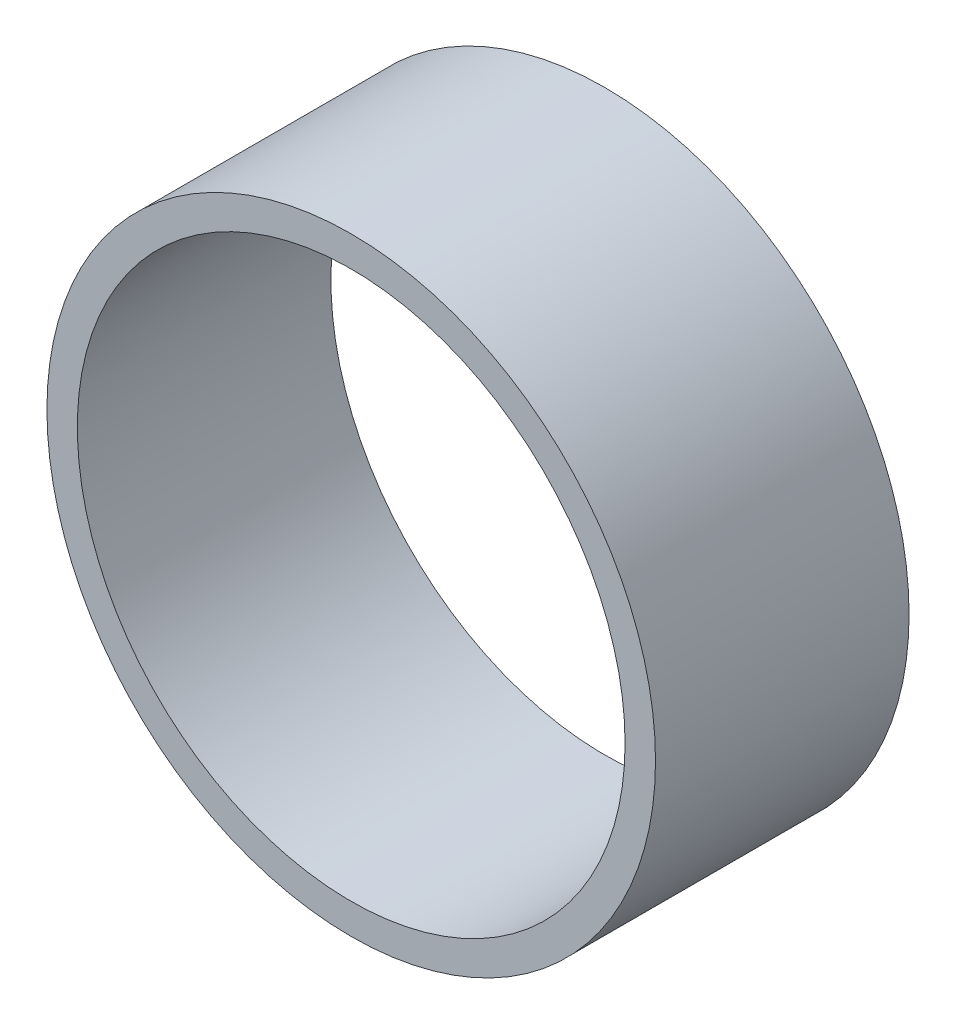
ISO-10303-21;
HEADER;
FILE_DESCRIPTION(('STEP AP214'),'2;1');
FILE_NAME('part.step','',(''),(''),'','','');
FILE_SCHEMA(('AUTOMOTIVE_DESIGN { 1 0 10303 214 1 1 1 1 }'));
ENDSEC;
DATA;
#1=APPLICATION_CONTEXT('core data for automotive mechanical design processes');
#2=APPLICATION_PROTOCOL_DEFINITION('international standard','automotive_design',2000,#1);
#3=PRODUCT_CONTEXT('',#1,'mechanical');
#4=PRODUCT('Part','Part','',(#3));
#5=PRODUCT_RELATED_PRODUCT_CATEGORY('part','',(#4));
#6=PRODUCT_DEFINITION_FORMATION('','',#4);
#7=PRODUCT_DEFINITION_CONTEXT('part definition',#1,'design');
#8=PRODUCT_DEFINITION('design','',#6,#7);
#9=PRODUCT_DEFINITION_SHAPE('','',#8);
#10=(LENGTH_UNIT() NAMED_UNIT(*) SI_UNIT(.MILLI.,.METRE.));
#11=(NAMED_UNIT(*) PLANE_ANGLE_UNIT() SI_UNIT($,.RADIAN.));
#12=(NAMED_UNIT(*) SI_UNIT($,.STERADIAN.) SOLID_ANGLE_UNIT());
#13=UNCERTAINTY_MEASURE_WITH_UNIT(LENGTH_MEASURE(1.E-05),#10,'distance_accuracy_value','');
#14=(GEOMETRIC_REPRESENTATION_CONTEXT(3) GLOBAL_UNCERTAINTY_ASSIGNED_CONTEXT((#13)) GLOBAL_UNIT_ASSIGNED_CONTEXT((#10,
#11,#12)) REPRESENTATION_CONTEXT('',''));
#15=CARTESIAN_POINT('',(0.,0.,0.));
#16=DIRECTION('',(0.,0.,1.));
#17=DIRECTION('',(1.,0.,0.));
#18=AXIS2_PLACEMENT_3D('',#15,#16,#17);
#19=CARTESIAN_POINT('',(0.,0.,25.));
#20=DIRECTION('',(0.,0.,1.));
#21=DIRECTION('',(1.,0.,0.));
#22=AXIS2_PLACEMENT_3D('',#19,#20,#21);
#23=PLANE('',#22);
#24=CARTESIAN_POINT('',(0.,0.,25.));
#25=DIRECTION('',(0.,0.,1.));
#26=DIRECTION('',(1.,0.,0.));
#27=AXIS2_PLACEMENT_3D('',#24,#25,#26);
#28=CIRCLE('',#27,30.);
#29=CARTESIAN_POINT('',(30.,0.,25.));
#30=VERTEX_POINT('',#29);
#31=EDGE_CURVE('E10',#30,#30,#28,.T.);
#32=ORIENTED_EDGE('',*,*,#31,.T.);
#33=EDGE_LOOP('',(#32));
#34=FACE_BOUND('',#33,.T.);
#35=CARTESIAN_POINT('',(0.,0.,25.));
#36=DIRECTION('',(0.,0.,1.));
#37=DIRECTION('',(1.,0.,0.));
#38=AXIS2_PLACEMENT_3D('',#35,#36,#37);
#39=CIRCLE('',#38,27.);
#40=CARTESIAN_POINT('',(27.,0.,25.));
#41=VERTEX_POINT('',#40);
#42=EDGE_CURVE('E42',#41,#41,#39,.T.);
#43=ORIENTED_EDGE('',*,*,#42,.F.);
#44=EDGE_LOOP('',(#43));
#45=FACE_BOUND('',#44,.T.);
#46=ADVANCED_FACE('F31',(#34,#45),#23,.T.);
#47=CARTESIAN_POINT('',(0.,0.,0.));
#48=DIRECTION('',(0.,0.,1.));
#49=DIRECTION('',(1.,0.,0.));
#50=AXIS2_PLACEMENT_3D('',#47,#48,#49);
#51=PLANE('',#50);
#52=CARTESIAN_POINT('',(0.,0.,0.));
#53=DIRECTION('',(0.,0.,1.));
#54=DIRECTION('',(1.,0.,0.));
#55=AXIS2_PLACEMENT_3D('',#52,#53,#54);
#56=CIRCLE('',#55,30.);
#57=CARTESIAN_POINT('',(30.,0.,0.));
#58=VERTEX_POINT('',#57);
#59=EDGE_CURVE('E35',#58,#58,#56,.T.);
#60=ORIENTED_EDGE('',*,*,#59,.F.);
#61=EDGE_LOOP('',(#60));
#62=FACE_BOUND('',#61,.T.);
#63=CARTESIAN_POINT('',(0.,0.,0.));
#64=DIRECTION('',(0.,0.,1.));
#65=DIRECTION('',(1.,0.,0.));
#66=AXIS2_PLACEMENT_3D('',#63,#64,#65);
#67=CIRCLE('',#66,27.);
#68=CARTESIAN_POINT('',(27.,0.,0.));
#69=VERTEX_POINT('',#68);
#70=EDGE_CURVE('E44',#69,#69,#67,.T.);
#71=ORIENTED_EDGE('',*,*,#70,.T.);
#72=EDGE_LOOP('',(#71));
#73=FACE_BOUND('',#72,.T.);
#74=ADVANCED_FACE('F54',(#62,#73),#51,.F.);
#75=CARTESIAN_POINT('',(0.,0.,25.));
#76=DIRECTION('',(0.,0.,-1.));
#77=DIRECTION('',(-1.,0.,0.));
#78=AXIS2_PLACEMENT_3D('',#75,#76,#77);
#79=CYLINDRICAL_SURFACE('',#78,30.);
#80=ORIENTED_EDGE('',*,*,#31,.F.);
#81=EDGE_LOOP('',(#80));
#82=FACE_BOUND('',#81,.T.);
#83=ORIENTED_EDGE('',*,*,#59,.T.);
#84=EDGE_LOOP('',(#83));
#85=FACE_BOUND('',#84,.T.);
#86=ADVANCED_FACE('F33',(#82,#85),#79,.T.);
#87=CARTESIAN_POINT('',(0.,0.,25.));
#88=DIRECTION('',(0.,0.,-1.));
#89=DIRECTION('',(-1.,0.,0.));
#90=AXIS2_PLACEMENT_3D('',#87,#88,#89);
#91=CYLINDRICAL_SURFACE('',#90,27.);
#92=ORIENTED_EDGE('',*,*,#42,.T.);
#93=EDGE_LOOP('',(#92));
#94=FACE_BOUND('',#93,.T.);
#95=ORIENTED_EDGE('',*,*,#70,.F.);
#96=EDGE_LOOP('',(#95));
#97=FACE_BOUND('',#96,.T.);
#98=ADVANCED_FACE('F50',(#94,#97),#91,.F.);
#99=CLOSED_SHELL('',(#46,#74,#86,#98));
#100=MANIFOLD_SOLID_BREP('B2',#99);
#101=ADVANCED_BREP_SHAPE_REPRESENTATION('',(#18,#100),#14);
#102=SHAPE_DEFINITION_REPRESENTATION(#9,#101);
ENDSEC;
END-ISO-10303-21;
